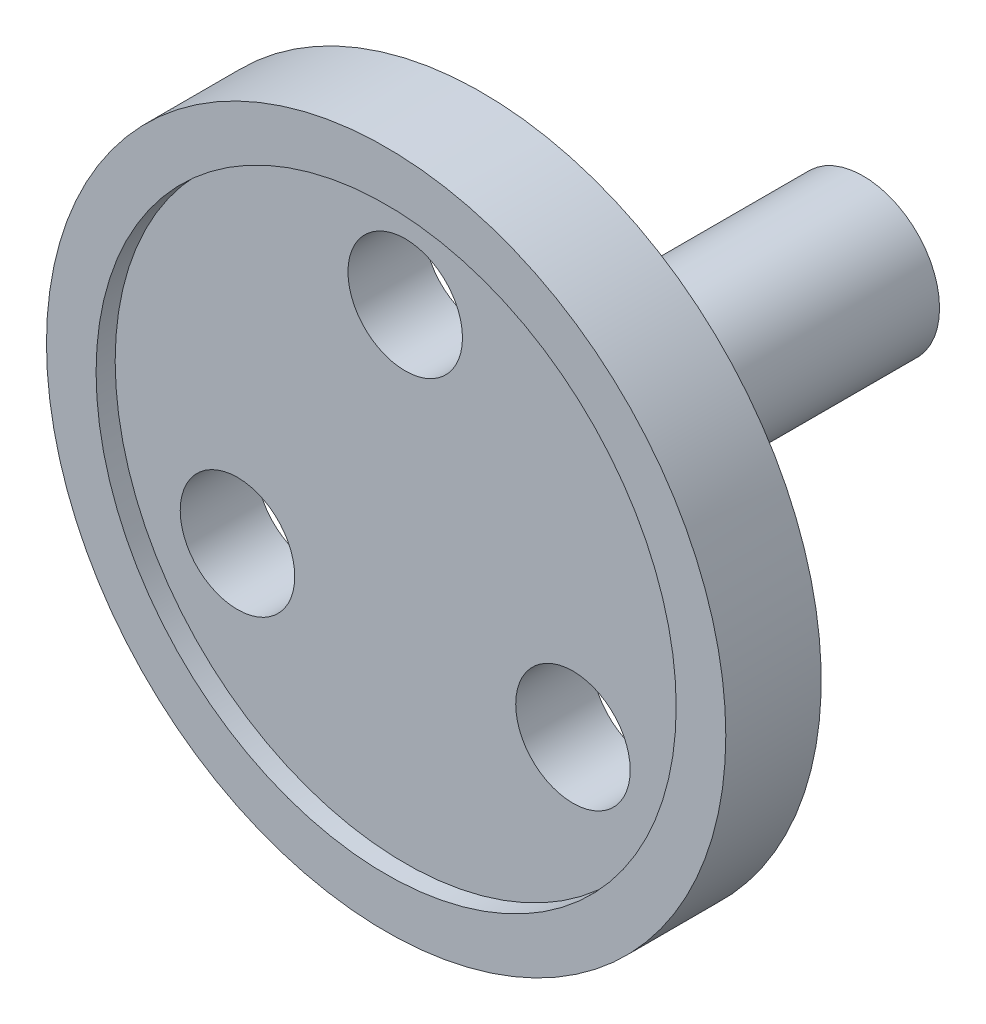
ISO-10303-21;
HEADER;
FILE_DESCRIPTION(('STEP AP214'),'2;1');
FILE_NAME('part.step','',(''),(''),'','','');
FILE_SCHEMA(('AUTOMOTIVE_DESIGN { 1 0 10303 214 1 1 1 1 }'));
ENDSEC;
DATA;
#1=APPLICATION_CONTEXT('core data for automotive mechanical design processes');
#2=APPLICATION_PROTOCOL_DEFINITION('international standard','automotive_design',2000,#1);
#3=PRODUCT_CONTEXT('',#1,'mechanical');
#4=PRODUCT('Part','Part','',(#3));
#5=PRODUCT_RELATED_PRODUCT_CATEGORY('part','',(#4));
#6=PRODUCT_DEFINITION_FORMATION('','',#4);
#7=PRODUCT_DEFINITION_CONTEXT('part definition',#1,'design');
#8=PRODUCT_DEFINITION('design','',#6,#7);
#9=PRODUCT_DEFINITION_SHAPE('','',#8);
#10=(LENGTH_UNIT() NAMED_UNIT(*) SI_UNIT(.MILLI.,.METRE.));
#11=(NAMED_UNIT(*) PLANE_ANGLE_UNIT() SI_UNIT($,.RADIAN.));
#12=(NAMED_UNIT(*) SI_UNIT($,.STERADIAN.) SOLID_ANGLE_UNIT());
#13=UNCERTAINTY_MEASURE_WITH_UNIT(LENGTH_MEASURE(1.E-05),#10,'distance_accuracy_value','');
#14=(GEOMETRIC_REPRESENTATION_CONTEXT(3) GLOBAL_UNCERTAINTY_ASSIGNED_CONTEXT((#13)) GLOBAL_UNIT_ASSIGNED_CONTEXT((#10,
#11,#12)) REPRESENTATION_CONTEXT('',''));
#15=CARTESIAN_POINT('',(0.,0.,0.));
#16=DIRECTION('',(0.,0.,1.));
#17=DIRECTION('',(1.,0.,0.));
#18=AXIS2_PLACEMENT_3D('',#15,#16,#17);
#19=CARTESIAN_POINT('',(0.,5.075,3.5));
#20=DIRECTION('',(0.,0.,-1.));
#21=DIRECTION('',(-1.,0.,0.));
#22=AXIS2_PLACEMENT_3D('',#19,#20,#21);
#23=CYLINDRICAL_SURFACE('',#22,1.50000000000041);
#24=CARTESIAN_POINT('',(0.,5.075,3.));
#25=DIRECTION('',(0.,0.,1.));
#26=DIRECTION('',(1.,0.,0.));
#27=AXIS2_PLACEMENT_3D('',#24,#25,#26);
#28=CIRCLE('',#27,1.50000000000041);
#29=CARTESIAN_POINT('',(1.50000000000041,5.075,3.));
#30=VERTEX_POINT('',#29);
#31=EDGE_CURVE('E42',#30,#30,#28,.T.);
#32=ORIENTED_EDGE('',*,*,#31,.T.);
#33=EDGE_LOOP('',(#32));
#34=FACE_BOUND('',#33,.T.);
#35=CARTESIAN_POINT('',(0.,5.075,1.));
#36=DIRECTION('',(0.,0.,-1.));
#37=DIRECTION('',(-1.,0.,0.));
#38=AXIS2_PLACEMENT_3D('',#35,#36,#37);
#39=CIRCLE('',#38,1.50000000000041);
#40=CARTESIAN_POINT('',(-1.50000000000041,5.075,1.));
#41=VERTEX_POINT('',#40);
#42=EDGE_CURVE('E55',#41,#41,#39,.T.);
#43=ORIENTED_EDGE('',*,*,#42,.T.);
#44=EDGE_LOOP('',(#43));
#45=FACE_BOUND('',#44,.T.);
#46=ADVANCED_FACE('F34',(#34,#45),#23,.F.);
#47=CARTESIAN_POINT('',(4.39507892420635,-2.53749999999981,3.5));
#48=DIRECTION('',(0.,0.,-1.));
#49=DIRECTION('',(-1.,0.,0.));
#50=AXIS2_PLACEMENT_3D('',#47,#48,#49);
#51=CYLINDRICAL_SURFACE('',#50,1.50000000000041);
#52=CARTESIAN_POINT('',(4.39507892420635,-2.53749999999981,3.));
#53=DIRECTION('',(0.,0.,1.));
#54=DIRECTION('',(1.,0.,0.));
#55=AXIS2_PLACEMENT_3D('',#52,#53,#54);
#56=CIRCLE('',#55,1.50000000000041);
#57=CARTESIAN_POINT('',(5.89507892420675,-2.53749999999981,3.));
#58=VERTEX_POINT('',#57);
#59=EDGE_CURVE('E46',#58,#58,#56,.T.);
#60=ORIENTED_EDGE('',*,*,#59,.T.);
#61=EDGE_LOOP('',(#60));
#62=FACE_BOUND('',#61,.T.);
#63=CARTESIAN_POINT('',(4.39507892420635,-2.53749999999981,1.));
#64=DIRECTION('',(0.,0.,-1.));
#65=DIRECTION('',(-1.,0.,0.));
#66=AXIS2_PLACEMENT_3D('',#63,#64,#65);
#67=CIRCLE('',#66,1.50000000000041);
#68=CARTESIAN_POINT('',(2.89507892420594,-2.53749999999981,1.));
#69=VERTEX_POINT('',#68);
#70=EDGE_CURVE('E60',#69,#69,#67,.T.);
#71=ORIENTED_EDGE('',*,*,#70,.T.);
#72=EDGE_LOOP('',(#71));
#73=FACE_BOUND('',#72,.T.);
#74=ADVANCED_FACE('F93',(#62,#73),#51,.F.);
#75=CARTESIAN_POINT('',(-4.39507892420571,-2.53750000000019,3.5));
#76=DIRECTION('',(0.,0.,-1.));
#77=DIRECTION('',(-1.,0.,0.));
#78=AXIS2_PLACEMENT_3D('',#75,#76,#77);
#79=CYLINDRICAL_SURFACE('',#78,1.50000000000041);
#80=CARTESIAN_POINT('',(-4.39507892420571,-2.53750000000019,3.));
#81=DIRECTION('',(0.,0.,1.));
#82=DIRECTION('',(1.,0.,0.));
#83=AXIS2_PLACEMENT_3D('',#80,#81,#82);
#84=CIRCLE('',#83,1.50000000000041);
#85=CARTESIAN_POINT('',(-2.8950789242053,-2.53750000000019,3.));
#86=VERTEX_POINT('',#85);
#87=EDGE_CURVE('E38',#86,#86,#84,.T.);
#88=ORIENTED_EDGE('',*,*,#87,.T.);
#89=EDGE_LOOP('',(#88));
#90=FACE_BOUND('',#89,.T.);
#91=CARTESIAN_POINT('',(-4.39507892420571,-2.53750000000019,1.));
#92=DIRECTION('',(0.,0.,-1.));
#93=DIRECTION('',(-1.,0.,0.));
#94=AXIS2_PLACEMENT_3D('',#91,#92,#93);
#95=CIRCLE('',#94,1.50000000000041);
#96=CARTESIAN_POINT('',(-5.89507892420611,-2.53750000000019,1.));
#97=VERTEX_POINT('',#96);
#98=EDGE_CURVE('E63',#97,#97,#95,.T.);
#99=ORIENTED_EDGE('',*,*,#98,.T.);
#100=EDGE_LOOP('',(#99));
#101=FACE_BOUND('',#100,.T.);
#102=ADVANCED_FACE('F99',(#90,#101),#79,.F.);
#103=CARTESIAN_POINT('',(0.,0.,3.5));
#104=DIRECTION('',(0.,0.,-1.));
#105=DIRECTION('',(-1.,0.,0.));
#106=AXIS2_PLACEMENT_3D('',#103,#104,#105);
#107=CYLINDRICAL_SURFACE('',#106,8.9);
#108=CARTESIAN_POINT('',(0.,0.,3.5));
#109=DIRECTION('',(0.,0.,1.));
#110=DIRECTION('',(1.,0.,0.));
#111=AXIS2_PLACEMENT_3D('',#108,#109,#110);
#112=CIRCLE('',#111,8.9);
#113=CARTESIAN_POINT('',(8.9,0.,3.5));
#114=VERTEX_POINT('',#113);
#115=EDGE_CURVE('E10',#114,#114,#112,.T.);
#116=ORIENTED_EDGE('',*,*,#115,.F.);
#117=EDGE_LOOP('',(#116));
#118=FACE_BOUND('',#117,.T.);
#119=CARTESIAN_POINT('',(0.,0.,1.));
#120=DIRECTION('',(0.,0.,-1.));
#121=DIRECTION('',(-1.,0.,0.));
#122=AXIS2_PLACEMENT_3D('',#119,#120,#121);
#123=CIRCLE('',#122,8.9);
#124=CARTESIAN_POINT('',(-8.9,0.,1.));
#125=VERTEX_POINT('',#124);
#126=EDGE_CURVE('E66',#125,#125,#123,.T.);
#127=ORIENTED_EDGE('',*,*,#126,.F.);
#128=EDGE_LOOP('',(#127));
#129=FACE_BOUND('',#128,.T.);
#130=ADVANCED_FACE('F36',(#118,#129),#107,.T.);
#131=CARTESIAN_POINT('',(0.,0.,3.5));
#132=DIRECTION('',(0.,0.,1.));
#133=DIRECTION('',(1.,0.,0.));
#134=AXIS2_PLACEMENT_3D('',#131,#132,#133);
#135=PLANE('',#134);
#136=CARTESIAN_POINT('',(0.,0.,3.5));
#137=DIRECTION('',(0.,0.,1.));
#138=DIRECTION('',(1.,0.,0.));
#139=AXIS2_PLACEMENT_3D('',#136,#137,#138);
#140=CIRCLE('',#139,7.6);
#141=CARTESIAN_POINT('',(7.6,0.,3.5));
#142=VERTEX_POINT('',#141);
#143=EDGE_CURVE('E51',#142,#142,#140,.T.);
#144=ORIENTED_EDGE('',*,*,#143,.F.);
#145=EDGE_LOOP('',(#144));
#146=FACE_BOUND('',#145,.T.);
#147=ORIENTED_EDGE('',*,*,#115,.T.);
#148=EDGE_LOOP('',(#147));
#149=FACE_BOUND('',#148,.T.);
#150=ADVANCED_FACE('F104',(#146,#149),#135,.T.);
#151=CARTESIAN_POINT('',(0.,0.,3.));
#152=DIRECTION('',(0.,0.,1.));
#153=DIRECTION('',(1.,0.,0.));
#154=AXIS2_PLACEMENT_3D('',#151,#152,#153);
#155=CYLINDRICAL_SURFACE('',#154,7.6);
#156=CARTESIAN_POINT('',(0.,0.,3.));
#157=DIRECTION('',(0.,0.,1.));
#158=DIRECTION('',(1.,0.,0.));
#159=AXIS2_PLACEMENT_3D('',#156,#157,#158);
#160=CIRCLE('',#159,7.6);
#161=CARTESIAN_POINT('',(7.6,0.,3.));
#162=VERTEX_POINT('',#161);
#163=EDGE_CURVE('E54',#162,#162,#160,.T.);
#164=ORIENTED_EDGE('',*,*,#163,.F.);
#165=EDGE_LOOP('',(#164));
#166=FACE_BOUND('',#165,.T.);
#167=ORIENTED_EDGE('',*,*,#143,.T.);
#168=EDGE_LOOP('',(#167));
#169=FACE_BOUND('',#168,.T.);
#170=ADVANCED_FACE('F106',(#166,#169),#155,.F.);
#171=CARTESIAN_POINT('',(0.,0.,3.));
#172=DIRECTION('',(0.,0.,1.));
#173=DIRECTION('',(1.,0.,0.));
#174=AXIS2_PLACEMENT_3D('',#171,#172,#173);
#175=PLANE('',#174);
#176=ORIENTED_EDGE('',*,*,#31,.F.);
#177=EDGE_LOOP('',(#176));
#178=FACE_BOUND('',#177,.T.);
#179=ORIENTED_EDGE('',*,*,#59,.F.);
#180=EDGE_LOOP('',(#179));
#181=FACE_BOUND('',#180,.T.);
#182=ORIENTED_EDGE('',*,*,#87,.F.);
#183=EDGE_LOOP('',(#182));
#184=FACE_BOUND('',#183,.T.);
#185=ORIENTED_EDGE('',*,*,#163,.T.);
#186=EDGE_LOOP('',(#185));
#187=FACE_BOUND('',#186,.T.);
#188=ADVANCED_FACE('F88',(#178,#181,#184,#187),#175,.T.);
#189=CARTESIAN_POINT('',(0.,0.,1.));
#190=DIRECTION('',(0.,0.,-1.));
#191=DIRECTION('',(-1.,0.,0.));
#192=AXIS2_PLACEMENT_3D('',#189,#190,#191);
#193=PLANE('',#192);
#194=ORIENTED_EDGE('',*,*,#42,.F.);
#195=EDGE_LOOP('',(#194));
#196=FACE_BOUND('',#195,.T.);
#197=ORIENTED_EDGE('',*,*,#70,.F.);
#198=EDGE_LOOP('',(#197));
#199=FACE_BOUND('',#198,.T.);
#200=ORIENTED_EDGE('',*,*,#98,.F.);
#201=EDGE_LOOP('',(#200));
#202=FACE_BOUND('',#201,.T.);
#203=CARTESIAN_POINT('',(0.,0.,1.));
#204=DIRECTION('',(0.,0.,-1.));
#205=DIRECTION('',(-1.,0.,0.));
#206=AXIS2_PLACEMENT_3D('',#203,#204,#205);
#207=CIRCLE('',#206,2.);
#208=CARTESIAN_POINT('',(2.,0.,1.));
#209=VERTEX_POINT('',#208);
#210=EDGE_CURVE('E69',#209,#209,#207,.T.);
#211=ORIENTED_EDGE('',*,*,#210,.F.);
#212=EDGE_LOOP('',(#211));
#213=FACE_BOUND('',#212,.T.);
#214=ORIENTED_EDGE('',*,*,#126,.T.);
#215=EDGE_LOOP('',(#214));
#216=FACE_BOUND('',#215,.T.);
#217=ADVANCED_FACE('F80',(#196,#199,#202,#213,#216),#193,.T.);
#218=CARTESIAN_POINT('',(0.,0.,-13.));
#219=DIRECTION('',(0.,0.,1.));
#220=DIRECTION('',(1.,0.,0.));
#221=AXIS2_PLACEMENT_3D('',#218,#219,#220);
#222=CYLINDRICAL_SURFACE('',#221,2.);
#223=CARTESIAN_POINT('',(0.,0.,-9.));
#224=DIRECTION('',(0.,0.,-1.));
#225=DIRECTION('',(-1.,0.,0.));
#226=AXIS2_PLACEMENT_3D('',#223,#224,#225);
#227=CIRCLE('',#226,2.);
#228=CARTESIAN_POINT('',(2.,0.,-9.));
#229=VERTEX_POINT('',#228);
#230=EDGE_CURVE('E72',#229,#229,#227,.T.);
#231=CARTESIAN_POINT('',(2.,0.,1.));
#232=CARTESIAN_POINT('',(2.,0.,0.895833333333334));
#233=CARTESIAN_POINT('',(2.,0.,0.791666666666667));
#234=CARTESIAN_POINT('',(2.,0.,0.583333333333334));
#235=CARTESIAN_POINT('',(2.,0.,0.479166666666667));
#236=CARTESIAN_POINT('',(2.,0.,0.270833333333334));
#237=CARTESIAN_POINT('',(2.,0.,0.166666666666667));
#238=CARTESIAN_POINT('',(2.,0.,-0.0416666666666667));
#239=CARTESIAN_POINT('',(2.,0.,-0.145833333333333));
#240=CARTESIAN_POINT('',(2.,0.,-0.354166666666667));
#241=CARTESIAN_POINT('',(2.,0.,-0.458333333333334));
#242=CARTESIAN_POINT('',(2.,0.,-0.666666666666667));
#243=CARTESIAN_POINT('',(2.,0.,-0.770833333333334));
#244=CARTESIAN_POINT('',(2.,0.,-0.979166666666667));
#245=CARTESIAN_POINT('',(2.,0.,-1.08333333333333));
#246=CARTESIAN_POINT('',(2.,0.,-1.29166666666667));
#247=CARTESIAN_POINT('',(2.,0.,-1.39583333333333));
#248=CARTESIAN_POINT('',(2.,0.,-1.60416666666667));
#249=CARTESIAN_POINT('',(2.,0.,-1.70833333333333));
#250=CARTESIAN_POINT('',(2.,0.,-1.91666666666667));
#251=CARTESIAN_POINT('',(2.,0.,-2.02083333333333));
#252=CARTESIAN_POINT('',(2.,0.,-2.22916666666667));
#253=CARTESIAN_POINT('',(2.,0.,-2.33333333333333));
#254=CARTESIAN_POINT('',(2.,0.,-2.54166666666667));
#255=CARTESIAN_POINT('',(2.,0.,-2.64583333333333));
#256=CARTESIAN_POINT('',(2.,0.,-2.85416666666667));
#257=CARTESIAN_POINT('',(2.,0.,-2.95833333333333));
#258=CARTESIAN_POINT('',(2.,0.,-3.16666666666667));
#259=CARTESIAN_POINT('',(2.,0.,-3.27083333333333));
#260=CARTESIAN_POINT('',(2.,0.,-3.47916666666667));
#261=CARTESIAN_POINT('',(2.,0.,-3.58333333333333));
#262=CARTESIAN_POINT('',(2.,0.,-3.79166666666667));
#263=CARTESIAN_POINT('',(2.,0.,-3.89583333333333));
#264=CARTESIAN_POINT('',(2.,0.,-4.10416666666667));
#265=CARTESIAN_POINT('',(2.,0.,-4.20833333333333));
#266=CARTESIAN_POINT('',(2.,0.,-4.41666666666667));
#267=CARTESIAN_POINT('',(2.,0.,-4.52083333333333));
#268=CARTESIAN_POINT('',(2.,0.,-4.72916666666667));
#269=CARTESIAN_POINT('',(2.,0.,-4.83333333333333));
#270=CARTESIAN_POINT('',(2.,0.,-5.04166666666667));
#271=CARTESIAN_POINT('',(2.,0.,-5.14583333333333));
#272=CARTESIAN_POINT('',(2.,0.,-5.35416666666667));
#273=CARTESIAN_POINT('',(2.,0.,-5.45833333333333));
#274=CARTESIAN_POINT('',(2.,0.,-5.66666666666667));
#275=CARTESIAN_POINT('',(2.,0.,-5.77083333333333));
#276=CARTESIAN_POINT('',(2.,0.,-5.97916666666667));
#277=CARTESIAN_POINT('',(2.,0.,-6.08333333333333));
#278=CARTESIAN_POINT('',(2.,0.,-6.29166666666667));
#279=CARTESIAN_POINT('',(2.,0.,-6.39583333333333));
#280=CARTESIAN_POINT('',(2.,0.,-6.60416666666667));
#281=CARTESIAN_POINT('',(2.,0.,-6.70833333333333));
#282=CARTESIAN_POINT('',(2.,0.,-6.91666666666667));
#283=CARTESIAN_POINT('',(2.,0.,-7.02083333333334));
#284=CARTESIAN_POINT('',(2.,0.,-7.22916666666667));
#285=CARTESIAN_POINT('',(2.,0.,-7.33333333333333));
#286=CARTESIAN_POINT('',(2.,0.,-7.54166666666667));
#287=CARTESIAN_POINT('',(2.,0.,-7.64583333333333));
#288=CARTESIAN_POINT('',(2.,0.,-7.85416666666667));
#289=CARTESIAN_POINT('',(2.,0.,-7.95833333333333));
#290=CARTESIAN_POINT('',(2.,0.,-8.16666666666667));
#291=CARTESIAN_POINT('',(2.,0.,-8.27083333333333));
#292=CARTESIAN_POINT('',(2.,0.,-8.47916666666667));
#293=CARTESIAN_POINT('',(2.,0.,-8.58333333333333));
#294=CARTESIAN_POINT('',(2.,0.,-8.79166666666667));
#295=CARTESIAN_POINT('',(2.,0.,-8.89583333333333));
#296=CARTESIAN_POINT('',(2.,0.,-9.));
#297=B_SPLINE_CURVE_WITH_KNOTS('',3,(#231,#232,#233,#234,#235,#236,#237,#238,#239,#240,#241,
#242,#243,#244,#245,#246,#247,#248,#249,#250,#251,#252,#253,#254,#255,#256,#257,#258,#259,#260,
#261,#262,#263,#264,#265,#266,#267,#268,#269,#270,#271,#272,#273,#274,#275,#276,#277,#278,#279,
#280,#281,#282,#283,#284,#285,#286,#287,#288,#289,#290,#291,#292,#293,#294,#295,#296),
.UNSPECIFIED.,.F.,.F.,(4,2,2,2,2,2,2,2,2,2,2,2,2,2,2,2,2,2,2,2,2,2,2,2,2,2,2,2,2,2,2,2,4),(0.,
0.3125,0.625000000000001,0.937500000000001,1.25,1.5625,1.875,2.1875,2.5,2.8125,3.125,3.4375,
3.75,4.0625,4.375,4.6875,5.,5.3125,5.625,5.9375,6.25,6.5625,6.875,7.1875,7.5,7.8125,8.125,
8.4375,8.75,9.0625,9.375,9.6875,10.),.UNSPECIFIED.);
#298=EDGE_CURVE('BSEAM78',#209,#229,#297,.T.);
#299=ORIENTED_EDGE('',*,*,#210,.T.);
#300=ORIENTED_EDGE('',*,*,#230,.F.);
#301=ORIENTED_EDGE('',*,*,#298,.T.);
#302=ORIENTED_EDGE('',*,*,#298,.F.);
#303=EDGE_LOOP('',(#299,#301,#300,#302));
#304=FACE_BOUND('',#303,.T.);
#305=ADVANCED_FACE('F78',(#304),#222,.T.);
#306=CARTESIAN_POINT('',(0.,0.,-9.));
#307=DIRECTION('',(0.,0.,-1.));
#308=DIRECTION('',(-1.,0.,0.));
#309=AXIS2_PLACEMENT_3D('',#306,#307,#308);
#310=PLANE('',#309);
#311=ORIENTED_EDGE('',*,*,#230,.T.);
#312=EDGE_LOOP('',(#311));
#313=FACE_BOUND('',#312,.T.);
#314=ADVANCED_FACE('F76',(#313),#310,.T.);
#315=CLOSED_SHELL('',(#46,#74,#102,#130,#150,#170,#188,#217,#305,#314));
#316=MANIFOLD_SOLID_BREP('B2',#315);
#317=ADVANCED_BREP_SHAPE_REPRESENTATION('',(#18,#316),#14);
#318=SHAPE_DEFINITION_REPRESENTATION(#9,#317);
ENDSEC;
END-ISO-10303-21;
